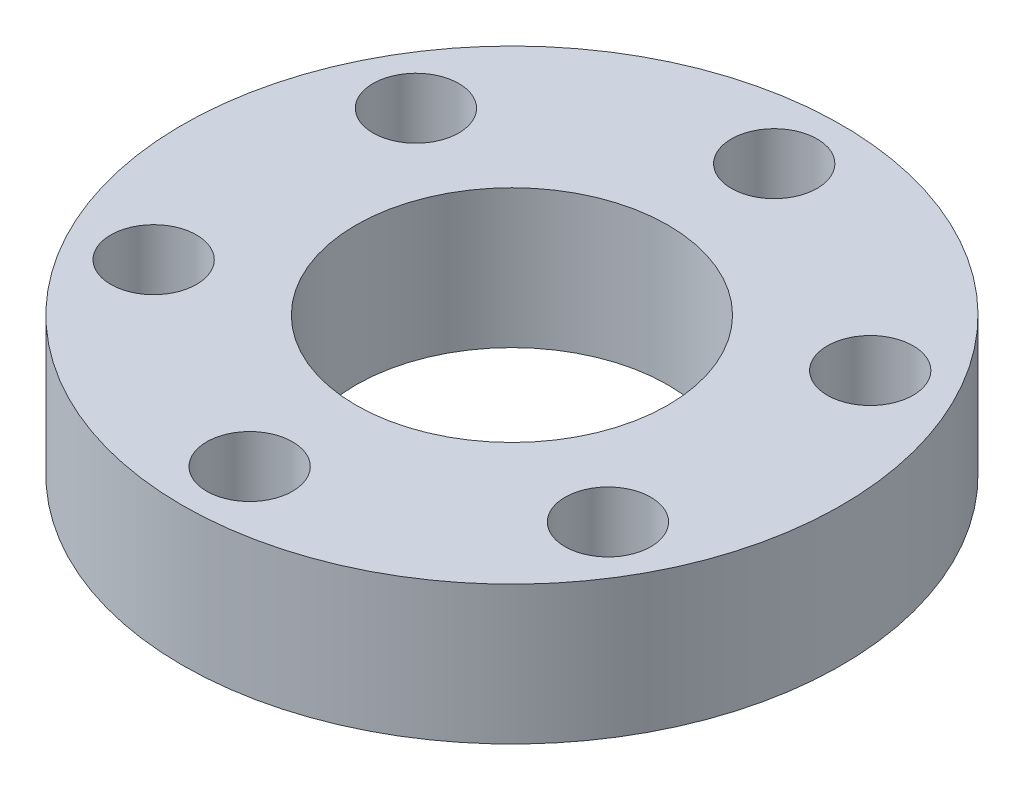
ISO-10303-21;
HEADER;
FILE_DESCRIPTION(('STEP AP214'),'2;1');
FILE_NAME('part.step','',(''),(''),'','','');
FILE_SCHEMA(('AUTOMOTIVE_DESIGN { 1 0 10303 214 1 1 1 1 }'));
ENDSEC;
DATA;
#1=APPLICATION_CONTEXT('core data for automotive mechanical design processes');
#2=APPLICATION_PROTOCOL_DEFINITION('international standard','automotive_design',2000,#1);
#3=PRODUCT_CONTEXT('',#1,'mechanical');
#4=PRODUCT('Part','Part','',(#3));
#5=PRODUCT_RELATED_PRODUCT_CATEGORY('part','',(#4));
#6=PRODUCT_DEFINITION_FORMATION('','',#4);
#7=PRODUCT_DEFINITION_CONTEXT('part definition',#1,'design');
#8=PRODUCT_DEFINITION('design','',#6,#7);
#9=PRODUCT_DEFINITION_SHAPE('','',#8);
#10=(LENGTH_UNIT() NAMED_UNIT(*) SI_UNIT(.MILLI.,.METRE.));
#11=(NAMED_UNIT(*) PLANE_ANGLE_UNIT() SI_UNIT($,.RADIAN.));
#12=(NAMED_UNIT(*) SI_UNIT($,.STERADIAN.) SOLID_ANGLE_UNIT());
#13=UNCERTAINTY_MEASURE_WITH_UNIT(LENGTH_MEASURE(1.E-05),#10,'distance_accuracy_value','');
#14=(GEOMETRIC_REPRESENTATION_CONTEXT(3) GLOBAL_UNCERTAINTY_ASSIGNED_CONTEXT((#13)) GLOBAL_UNIT_ASSIGNED_CONTEXT((#10,
#11,#12)) REPRESENTATION_CONTEXT('',''));
#15=CARTESIAN_POINT('',(0.,0.,0.));
#16=DIRECTION('',(0.,0.,1.));
#17=DIRECTION('',(1.,0.,0.));
#18=AXIS2_PLACEMENT_3D('',#15,#16,#17);
#19=CARTESIAN_POINT('',(0.,7.1,0.));
#20=DIRECTION('',(0.,-1.,0.));
#21=DIRECTION('',(0.,0.,-1.));
#22=AXIS2_PLACEMENT_3D('',#19,#20,#21);
#23=CYLINDRICAL_SURFACE('',#22,16.9);
#24=CARTESIAN_POINT('',(0.,7.1,0.));
#25=DIRECTION('',(0.,1.,0.));
#26=DIRECTION('',(0.,0.,1.));
#27=AXIS2_PLACEMENT_3D('',#24,#25,#26);
#28=CIRCLE('',#27,16.9);
#29=CARTESIAN_POINT('',(0.,7.1,16.9));
#30=VERTEX_POINT('',#29);
#31=EDGE_CURVE('E45',#30,#30,#28,.T.);
#32=ORIENTED_EDGE('',*,*,#31,.F.);
#33=EDGE_LOOP('',(#32));
#34=FACE_BOUND('',#33,.T.);
#35=CARTESIAN_POINT('',(0.,0.,0.));
#36=DIRECTION('',(0.,1.,0.));
#37=DIRECTION('',(0.,0.,1.));
#38=AXIS2_PLACEMENT_3D('',#35,#36,#37);
#39=CIRCLE('',#38,16.9);
#40=CARTESIAN_POINT('',(0.,0.,16.9));
#41=VERTEX_POINT('',#40);
#42=EDGE_CURVE('E71',#41,#41,#39,.T.);
#43=ORIENTED_EDGE('',*,*,#42,.T.);
#44=EDGE_LOOP('',(#43));
#45=FACE_BOUND('',#44,.T.);
#46=ADVANCED_FACE('F37',(#34,#45),#23,.T.);
#47=CARTESIAN_POINT('',(-11.6480416808998,7.1,6.7250000000005));
#48=DIRECTION('',(0.,-1.,0.));
#49=DIRECTION('',(0.,0.,-1.));
#50=AXIS2_PLACEMENT_3D('',#47,#48,#49);
#51=CYLINDRICAL_SURFACE('',#50,2.20000000000109);
#52=CARTESIAN_POINT('',(-11.6480416808998,7.1,6.7250000000005));
#53=DIRECTION('',(0.,1.,0.));
#54=DIRECTION('',(0.,0.,1.));
#55=AXIS2_PLACEMENT_3D('',#52,#53,#54);
#56=CIRCLE('',#55,2.20000000000109);
#57=CARTESIAN_POINT('',(-11.6480416808998,7.1,8.92500000000159));
#58=VERTEX_POINT('',#57);
#59=EDGE_CURVE('E50',#58,#58,#56,.T.);
#60=ORIENTED_EDGE('',*,*,#59,.T.);
#61=EDGE_LOOP('',(#60));
#62=FACE_BOUND('',#61,.T.);
#63=CARTESIAN_POINT('',(-11.6480416808998,0.,6.7250000000005));
#64=DIRECTION('',(0.,1.,0.));
#65=DIRECTION('',(0.,0.,1.));
#66=AXIS2_PLACEMENT_3D('',#63,#64,#65);
#67=CIRCLE('',#66,2.20000000000109);
#68=CARTESIAN_POINT('',(-11.6480416808998,0.,8.92500000000159));
#69=VERTEX_POINT('',#68);
#70=EDGE_CURVE('E69',#69,#69,#67,.T.);
#71=ORIENTED_EDGE('',*,*,#70,.F.);
#72=EDGE_LOOP('',(#71));
#73=FACE_BOUND('',#72,.T.);
#74=ADVANCED_FACE('F98',(#62,#73),#51,.F.);
#75=CARTESIAN_POINT('',(1.1435216756271E-12,7.1,13.45));
#76=DIRECTION('',(0.,-1.,0.));
#77=DIRECTION('',(0.,0.,-1.));
#78=AXIS2_PLACEMENT_3D('',#75,#76,#77);
#79=CYLINDRICAL_SURFACE('',#78,2.20000000000118);
#80=CARTESIAN_POINT('',(1.1435216756271E-12,7.1,13.45));
#81=DIRECTION('',(0.,1.,0.));
#82=DIRECTION('',(0.,0.,1.));
#83=AXIS2_PLACEMENT_3D('',#80,#81,#82);
#84=CIRCLE('',#83,2.20000000000118);
#85=CARTESIAN_POINT('',(1.1435216756271E-12,7.1,15.6500000000012));
#86=VERTEX_POINT('',#85);
#87=EDGE_CURVE('E93',#86,#86,#84,.T.);
#88=ORIENTED_EDGE('',*,*,#87,.T.);
#89=EDGE_LOOP('',(#88));
#90=FACE_BOUND('',#89,.T.);
#91=CARTESIAN_POINT('',(1.1435216756271E-12,0.,13.45));
#92=DIRECTION('',(0.,1.,0.));
#93=DIRECTION('',(0.,0.,1.));
#94=AXIS2_PLACEMENT_3D('',#91,#92,#93);
#95=CIRCLE('',#94,2.20000000000118);
#96=CARTESIAN_POINT('',(1.1435216756271E-12,0.,15.6500000000012));
#97=VERTEX_POINT('',#96);
#98=EDGE_CURVE('E66',#97,#97,#95,.T.);
#99=ORIENTED_EDGE('',*,*,#98,.F.);
#100=EDGE_LOOP('',(#99));
#101=FACE_BOUND('',#100,.T.);
#102=ADVANCED_FACE('F116',(#90,#101),#79,.F.);
#103=CARTESIAN_POINT('',(11.6480416809016,7.1,6.7249999999995));
#104=DIRECTION('',(0.,-1.,0.));
#105=DIRECTION('',(0.,0.,-1.));
#106=AXIS2_PLACEMENT_3D('',#103,#104,#105);
#107=CYLINDRICAL_SURFACE('',#106,2.20000000000074);
#108=CARTESIAN_POINT('',(11.6480416809016,7.1,6.7249999999995));
#109=DIRECTION('',(0.,1.,0.));
#110=DIRECTION('',(0.,0.,1.));
#111=AXIS2_PLACEMENT_3D('',#108,#109,#110);
#112=CIRCLE('',#111,2.20000000000074);
#113=CARTESIAN_POINT('',(11.6480416809016,7.1,8.92500000000024));
#114=VERTEX_POINT('',#113);
#115=EDGE_CURVE('E90',#114,#114,#112,.T.);
#116=ORIENTED_EDGE('',*,*,#115,.T.);
#117=EDGE_LOOP('',(#116));
#118=FACE_BOUND('',#117,.T.);
#119=CARTESIAN_POINT('',(11.6480416809016,0.,6.7249999999995));
#120=DIRECTION('',(0.,1.,0.));
#121=DIRECTION('',(0.,0.,1.));
#122=AXIS2_PLACEMENT_3D('',#119,#120,#121);
#123=CIRCLE('',#122,2.20000000000074);
#124=CARTESIAN_POINT('',(11.6480416809016,0.,8.92500000000024));
#125=VERTEX_POINT('',#124);
#126=EDGE_CURVE('E63',#125,#125,#123,.T.);
#127=ORIENTED_EDGE('',*,*,#126,.F.);
#128=EDGE_LOOP('',(#127));
#129=FACE_BOUND('',#128,.T.);
#130=ADVANCED_FACE('F123',(#118,#129),#107,.F.);
#131=CARTESIAN_POINT('',(11.648041680901,7.1,-6.7250000000005));
#132=DIRECTION('',(0.,-1.,0.));
#133=DIRECTION('',(0.,0.,-1.));
#134=AXIS2_PLACEMENT_3D('',#131,#132,#133);
#135=CYLINDRICAL_SURFACE('',#134,2.20000000000016);
#136=CARTESIAN_POINT('',(11.648041680901,7.1,-6.7250000000005));
#137=DIRECTION('',(0.,1.,0.));
#138=DIRECTION('',(0.,0.,1.));
#139=AXIS2_PLACEMENT_3D('',#136,#137,#138);
#140=CIRCLE('',#139,2.20000000000016);
#141=CARTESIAN_POINT('',(11.648041680901,7.1,-4.52500000000034));
#142=VERTEX_POINT('',#141);
#143=EDGE_CURVE('E85',#142,#142,#140,.T.);
#144=ORIENTED_EDGE('',*,*,#143,.T.);
#145=EDGE_LOOP('',(#144));
#146=FACE_BOUND('',#145,.T.);
#147=CARTESIAN_POINT('',(11.648041680901,0.,-6.7250000000005));
#148=DIRECTION('',(0.,1.,0.));
#149=DIRECTION('',(0.,0.,1.));
#150=AXIS2_PLACEMENT_3D('',#147,#148,#149);
#151=CIRCLE('',#150,2.20000000000016);
#152=CARTESIAN_POINT('',(11.648041680901,0.,-4.52500000000034));
#153=VERTEX_POINT('',#152);
#154=EDGE_CURVE('E60',#153,#153,#151,.T.);
#155=ORIENTED_EDGE('',*,*,#154,.F.);
#156=EDGE_LOOP('',(#155));
#157=FACE_BOUND('',#156,.T.);
#158=ADVANCED_FACE('F127',(#146,#157),#135,.F.);
#159=CARTESIAN_POINT('',(0.,7.1,-13.45));
#160=DIRECTION('',(0.,-1.,0.));
#161=DIRECTION('',(0.,0.,-1.));
#162=AXIS2_PLACEMENT_3D('',#159,#160,#161);
#163=CYLINDRICAL_SURFACE('',#162,2.2);
#164=CARTESIAN_POINT('',(0.,7.1,-13.45));
#165=DIRECTION('',(0.,1.,0.));
#166=DIRECTION('',(0.,0.,1.));
#167=AXIS2_PLACEMENT_3D('',#164,#165,#166);
#168=CIRCLE('',#167,2.2);
#169=CARTESIAN_POINT('',(0.,7.1,-11.25));
#170=VERTEX_POINT('',#169);
#171=EDGE_CURVE('E80',#170,#170,#168,.T.);
#172=ORIENTED_EDGE('',*,*,#171,.T.);
#173=EDGE_LOOP('',(#172));
#174=FACE_BOUND('',#173,.T.);
#175=CARTESIAN_POINT('',(0.,0.,-13.45));
#176=DIRECTION('',(0.,1.,0.));
#177=DIRECTION('',(0.,0.,1.));
#178=AXIS2_PLACEMENT_3D('',#175,#176,#177);
#179=CIRCLE('',#178,2.2);
#180=CARTESIAN_POINT('',(0.,0.,-11.25));
#181=VERTEX_POINT('',#180);
#182=EDGE_CURVE('E57',#181,#181,#179,.T.);
#183=ORIENTED_EDGE('',*,*,#182,.F.);
#184=EDGE_LOOP('',(#183));
#185=FACE_BOUND('',#184,.T.);
#186=ADVANCED_FACE('F130',(#174,#185),#163,.F.);
#187=CARTESIAN_POINT('',(-11.6480416809004,7.1,-6.7249999999995));
#188=DIRECTION('',(0.,-1.,0.));
#189=DIRECTION('',(0.,0.,-1.));
#190=AXIS2_PLACEMENT_3D('',#187,#188,#189);
#191=CYLINDRICAL_SURFACE('',#190,2.20000000000058);
#192=CARTESIAN_POINT('',(-11.6480416809004,7.1,-6.7249999999995));
#193=DIRECTION('',(0.,1.,0.));
#194=DIRECTION('',(0.,0.,1.));
#195=AXIS2_PLACEMENT_3D('',#192,#193,#194);
#196=CIRCLE('',#195,2.20000000000058);
#197=CARTESIAN_POINT('',(-11.6480416809004,7.1,-4.52499999999892));
#198=VERTEX_POINT('',#197);
#199=EDGE_CURVE('E76',#198,#198,#196,.T.);
#200=ORIENTED_EDGE('',*,*,#199,.T.);
#201=EDGE_LOOP('',(#200));
#202=FACE_BOUND('',#201,.T.);
#203=CARTESIAN_POINT('',(-11.6480416809004,0.,-6.7249999999995));
#204=DIRECTION('',(0.,1.,0.));
#205=DIRECTION('',(0.,0.,1.));
#206=AXIS2_PLACEMENT_3D('',#203,#204,#205);
#207=CIRCLE('',#206,2.20000000000058);
#208=CARTESIAN_POINT('',(-11.6480416809004,0.,-4.52499999999892));
#209=VERTEX_POINT('',#208);
#210=EDGE_CURVE('E54',#209,#209,#207,.T.);
#211=ORIENTED_EDGE('',*,*,#210,.F.);
#212=EDGE_LOOP('',(#211));
#213=FACE_BOUND('',#212,.T.);
#214=ADVANCED_FACE('F39',(#202,#213),#191,.F.);
#215=CARTESIAN_POINT('',(0.,7.1,0.));
#216=DIRECTION('',(0.,-1.,0.));
#217=DIRECTION('',(0.,0.,-1.));
#218=AXIS2_PLACEMENT_3D('',#215,#216,#217);
#219=CYLINDRICAL_SURFACE('',#218,8.);
#220=CARTESIAN_POINT('',(0.,7.1,0.));
#221=DIRECTION('',(0.,1.,0.));
#222=DIRECTION('',(0.,0.,1.));
#223=AXIS2_PLACEMENT_3D('',#220,#221,#222);
#224=CIRCLE('',#223,8.);
#225=CARTESIAN_POINT('',(0.,7.1,8.));
#226=VERTEX_POINT('',#225);
#227=EDGE_CURVE('E10',#226,#226,#224,.T.);
#228=ORIENTED_EDGE('',*,*,#227,.T.);
#229=EDGE_LOOP('',(#228));
#230=FACE_BOUND('',#229,.T.);
#231=CARTESIAN_POINT('',(0.,0.,0.));
#232=DIRECTION('',(0.,1.,0.));
#233=DIRECTION('',(0.,0.,1.));
#234=AXIS2_PLACEMENT_3D('',#231,#232,#233);
#235=CIRCLE('',#234,8.);
#236=CARTESIAN_POINT('',(0.,0.,8.));
#237=VERTEX_POINT('',#236);
#238=EDGE_CURVE('E41',#237,#237,#235,.T.);
#239=ORIENTED_EDGE('',*,*,#238,.F.);
#240=EDGE_LOOP('',(#239));
#241=FACE_BOUND('',#240,.T.);
#242=ADVANCED_FACE('F105',(#230,#241),#219,.F.);
#243=CARTESIAN_POINT('',(0.,7.1,0.));
#244=DIRECTION('',(0.,1.,0.));
#245=DIRECTION('',(0.,0.,1.));
#246=AXIS2_PLACEMENT_3D('',#243,#244,#245);
#247=PLANE('',#246);
#248=ORIENTED_EDGE('',*,*,#199,.F.);
#249=EDGE_LOOP('',(#248));
#250=FACE_BOUND('',#249,.T.);
#251=ORIENTED_EDGE('',*,*,#171,.F.);
#252=EDGE_LOOP('',(#251));
#253=FACE_BOUND('',#252,.T.);
#254=ORIENTED_EDGE('',*,*,#143,.F.);
#255=EDGE_LOOP('',(#254));
#256=FACE_BOUND('',#255,.T.);
#257=ORIENTED_EDGE('',*,*,#115,.F.);
#258=EDGE_LOOP('',(#257));
#259=FACE_BOUND('',#258,.T.);
#260=ORIENTED_EDGE('',*,*,#87,.F.);
#261=EDGE_LOOP('',(#260));
#262=FACE_BOUND('',#261,.T.);
#263=ORIENTED_EDGE('',*,*,#59,.F.);
#264=EDGE_LOOP('',(#263));
#265=FACE_BOUND('',#264,.T.);
#266=ORIENTED_EDGE('',*,*,#31,.T.);
#267=EDGE_LOOP('',(#266));
#268=FACE_BOUND('',#267,.T.);
#269=ORIENTED_EDGE('',*,*,#227,.F.);
#270=EDGE_LOOP('',(#269));
#271=FACE_BOUND('',#270,.T.);
#272=ADVANCED_FACE('F101',(#250,#253,#256,#259,#262,#265,#268,#271),#247,.T.);
#273=CARTESIAN_POINT('',(0.,0.,0.));
#274=DIRECTION('',(0.,1.,0.));
#275=DIRECTION('',(0.,0.,1.));
#276=AXIS2_PLACEMENT_3D('',#273,#274,#275);
#277=PLANE('',#276);
#278=ORIENTED_EDGE('',*,*,#210,.T.);
#279=EDGE_LOOP('',(#278));
#280=FACE_BOUND('',#279,.T.);
#281=ORIENTED_EDGE('',*,*,#182,.T.);
#282=EDGE_LOOP('',(#281));
#283=FACE_BOUND('',#282,.T.);
#284=ORIENTED_EDGE('',*,*,#154,.T.);
#285=EDGE_LOOP('',(#284));
#286=FACE_BOUND('',#285,.T.);
#287=ORIENTED_EDGE('',*,*,#126,.T.);
#288=EDGE_LOOP('',(#287));
#289=FACE_BOUND('',#288,.T.);
#290=ORIENTED_EDGE('',*,*,#98,.T.);
#291=EDGE_LOOP('',(#290));
#292=FACE_BOUND('',#291,.T.);
#293=ORIENTED_EDGE('',*,*,#70,.T.);
#294=EDGE_LOOP('',(#293));
#295=FACE_BOUND('',#294,.T.);
#296=ORIENTED_EDGE('',*,*,#42,.F.);
#297=EDGE_LOOP('',(#296));
#298=FACE_BOUND('',#297,.T.);
#299=ORIENTED_EDGE('',*,*,#238,.T.);
#300=EDGE_LOOP('',(#299));
#301=FACE_BOUND('',#300,.T.);
#302=ADVANCED_FACE('F104',(#280,#283,#286,#289,#292,#295,#298,#301),#277,.F.);
#303=CLOSED_SHELL('',(#46,#74,#102,#130,#158,#186,#214,#242,#272,#302));
#304=MANIFOLD_SOLID_BREP('B2',#303);
#305=ADVANCED_BREP_SHAPE_REPRESENTATION('',(#18,#304),#14);
#306=SHAPE_DEFINITION_REPRESENTATION(#9,#305);
ENDSEC;
END-ISO-10303-21;
